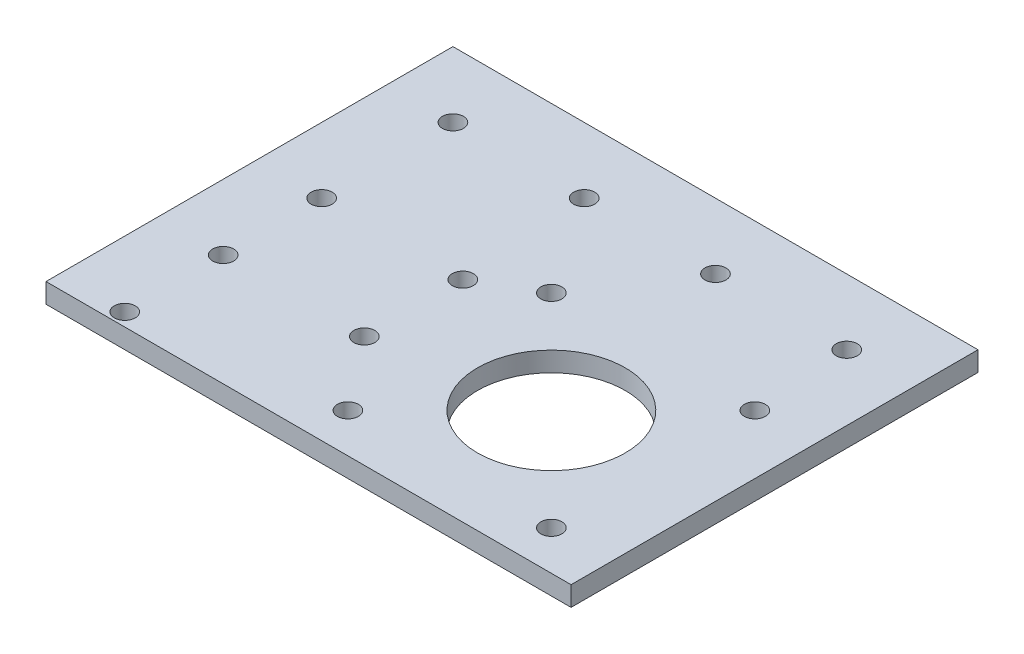
ISO-10303-21;
HEADER;
FILE_DESCRIPTION(('STEP AP214'),'2;1');
FILE_NAME('part.step','',(''),(''),'','','');
FILE_SCHEMA(('AUTOMOTIVE_DESIGN { 1 0 10303 214 1 1 1 1 }'));
ENDSEC;
DATA;
#1=APPLICATION_CONTEXT('core data for automotive mechanical design processes');
#2=APPLICATION_PROTOCOL_DEFINITION('international standard','automotive_design',2000,#1);
#3=PRODUCT_CONTEXT('',#1,'mechanical');
#4=PRODUCT('Part','Part','',(#3));
#5=PRODUCT_RELATED_PRODUCT_CATEGORY('part','',(#4));
#6=PRODUCT_DEFINITION_FORMATION('','',#4);
#7=PRODUCT_DEFINITION_CONTEXT('part definition',#1,'design');
#8=PRODUCT_DEFINITION('design','',#6,#7);
#9=PRODUCT_DEFINITION_SHAPE('','',#8);
#10=(LENGTH_UNIT() NAMED_UNIT(*) SI_UNIT(.MILLI.,.METRE.));
#11=(NAMED_UNIT(*) PLANE_ANGLE_UNIT() SI_UNIT($,.RADIAN.));
#12=(NAMED_UNIT(*) SI_UNIT($,.STERADIAN.) SOLID_ANGLE_UNIT());
#13=UNCERTAINTY_MEASURE_WITH_UNIT(LENGTH_MEASURE(1.E-05),#10,'distance_accuracy_value','');
#14=(GEOMETRIC_REPRESENTATION_CONTEXT(3) GLOBAL_UNCERTAINTY_ASSIGNED_CONTEXT((#13)) GLOBAL_UNIT_ASSIGNED_CONTEXT((#10,
#11,#12)) REPRESENTATION_CONTEXT('',''));
#15=CARTESIAN_POINT('',(0.,0.,0.));
#16=DIRECTION('',(0.,0.,1.));
#17=DIRECTION('',(1.,0.,0.));
#18=AXIS2_PLACEMENT_3D('',#15,#16,#17);
#19=CARTESIAN_POINT('',(0.,3.,0.));
#20=DIRECTION('',(0.,1.,0.));
#21=DIRECTION('',(0.,0.,1.));
#22=AXIS2_PLACEMENT_3D('',#19,#20,#21);
#23=PLANE('',#22);
#24=CARTESIAN_POINT('',(31.5,3.,45.));
#25=DIRECTION('',(0.,1.,0.));
#26=DIRECTION('',(0.,0.,1.));
#27=AXIS2_PLACEMENT_3D('',#24,#25,#26);
#28=CIRCLE('',#27,1.60000000000001);
#29=CARTESIAN_POINT('',(31.5,3.,46.6));
#30=VERTEX_POINT('',#29);
#31=EDGE_CURVE('E187',#30,#30,#28,.T.);
#32=ORIENTED_EDGE('',*,*,#31,.F.);
#33=EDGE_LOOP('',(#32));
#34=FACE_BOUND('',#33,.T.);
#35=CARTESIAN_POINT('',(71.,3.,56.));
#36=DIRECTION('',(0.,1.,0.));
#37=DIRECTION('',(0.,0.,1.));
#38=AXIS2_PLACEMENT_3D('',#35,#36,#37);
#39=CIRCLE('',#38,1.60000000000002);
#40=CARTESIAN_POINT('',(71.,3.,57.6));
#41=VERTEX_POINT('',#40);
#42=EDGE_CURVE('E175',#41,#41,#39,.T.);
#43=ORIENTED_EDGE('',*,*,#42,.F.);
#44=EDGE_LOOP('',(#43));
#45=FACE_BOUND('',#44,.T.);
#46=CARTESIAN_POINT('',(70.,3.,10.));
#47=DIRECTION('',(0.,1.,0.));
#48=DIRECTION('',(0.,0.,1.));
#49=AXIS2_PLACEMENT_3D('',#46,#47,#48);
#50=CIRCLE('',#49,1.60000000000002);
#51=CARTESIAN_POINT('',(70.,3.,11.6));
#52=VERTEX_POINT('',#51);
#53=EDGE_CURVE('E163',#52,#52,#50,.T.);
#54=ORIENTED_EDGE('',*,*,#53,.F.);
#55=EDGE_LOOP('',(#54));
#56=FACE_BOUND('',#55,.T.);
#57=CARTESIAN_POINT('',(50.,3.,10.));
#58=DIRECTION('',(0.,1.,0.));
#59=DIRECTION('',(0.,0.,1.));
#60=AXIS2_PLACEMENT_3D('',#57,#58,#59);
#61=CIRCLE('',#60,1.60000000000001);
#62=CARTESIAN_POINT('',(50.,3.,11.6));
#63=VERTEX_POINT('',#62);
#64=EDGE_CURVE('E151',#63,#63,#61,.T.);
#65=ORIENTED_EDGE('',*,*,#64,.F.);
#66=EDGE_LOOP('',(#65));
#67=FACE_BOUND('',#66,.T.);
#68=CARTESIAN_POINT('',(10.,3.,60.));
#69=DIRECTION('',(0.,1.,0.));
#70=DIRECTION('',(0.,0.,1.));
#71=AXIS2_PLACEMENT_3D('',#68,#69,#70);
#72=CIRCLE('',#71,1.60000000000001);
#73=CARTESIAN_POINT('',(10.,3.,61.6));
#74=VERTEX_POINT('',#73);
#75=EDGE_CURVE('E139',#74,#74,#72,.T.);
#76=ORIENTED_EDGE('',*,*,#75,.F.);
#77=EDGE_LOOP('',(#76));
#78=FACE_BOUND('',#77,.T.);
#79=CARTESIAN_POINT('',(10.,3.,45.));
#80=DIRECTION('',(0.,1.,0.));
#81=DIRECTION('',(0.,0.,1.));
#82=AXIS2_PLACEMENT_3D('',#79,#80,#81);
#83=CIRCLE('',#82,1.6);
#84=CARTESIAN_POINT('',(10.,3.,46.6));
#85=VERTEX_POINT('',#84);
#86=EDGE_CURVE('E127',#85,#85,#83,.T.);
#87=ORIENTED_EDGE('',*,*,#86,.F.);
#88=EDGE_LOOP('',(#87));
#89=FACE_BOUND('',#88,.T.);
#90=CARTESIAN_POINT('',(10.,3.,10.));
#91=DIRECTION('',(0.,1.,0.));
#92=DIRECTION('',(0.,0.,1.));
#93=AXIS2_PLACEMENT_3D('',#90,#91,#92);
#94=CIRCLE('',#93,1.6);
#95=CARTESIAN_POINT('',(10.,3.,11.6));
#96=VERTEX_POINT('',#95);
#97=EDGE_CURVE('E106',#96,#96,#94,.T.);
#98=ORIENTED_EDGE('',*,*,#97,.F.);
#99=EDGE_LOOP('',(#98));
#100=FACE_BOUND('',#99,.T.);
#101=DIRECTION('',(0.,0.,1.));
#102=VECTOR('',#101,1.);
#103=CARTESIAN_POINT('',(0.,3.,0.));
#104=LINE('',#103,#102);
#105=CARTESIAN_POINT('',(0.,3.,0.));
#106=VERTEX_POINT('',#105);
#107=CARTESIAN_POINT('',(0.,3.,62.));
#108=VERTEX_POINT('',#107);
#109=EDGE_CURVE('E91',#106,#108,#104,.T.);
#110=ORIENTED_EDGE('',*,*,#109,.T.);
#111=DIRECTION('',(1.,0.,0.));
#112=VECTOR('',#111,1.);
#113=CARTESIAN_POINT('',(0.,3.,62.));
#114=LINE('',#113,#112);
#115=CARTESIAN_POINT('',(80.,3.,62.));
#116=VERTEX_POINT('',#115);
#117=EDGE_CURVE('E86',#108,#116,#114,.T.);
#118=ORIENTED_EDGE('',*,*,#117,.T.);
#119=DIRECTION('',(0.,0.,-1.));
#120=VECTOR('',#119,1.);
#121=CARTESIAN_POINT('',(80.,3.,0.));
#122=LINE('',#121,#120);
#123=CARTESIAN_POINT('',(80.,3.,0.));
#124=VERTEX_POINT('',#123);
#125=EDGE_CURVE('E89',#116,#124,#122,.T.);
#126=ORIENTED_EDGE('',*,*,#125,.T.);
#127=DIRECTION('',(-1.,0.,0.));
#128=VECTOR('',#127,1.);
#129=CARTESIAN_POINT('',(0.,3.,0.));
#130=LINE('',#129,#128);
#131=EDGE_CURVE('E56',#124,#106,#130,.T.);
#132=ORIENTED_EDGE('',*,*,#131,.T.);
#133=EDGE_LOOP('',(#110,#118,#126,#132));
#134=FACE_BOUND('',#133,.T.);
#135=CARTESIAN_POINT('',(10.,3.,30.));
#136=DIRECTION('',(0.,1.,0.));
#137=DIRECTION('',(0.,0.,1.));
#138=AXIS2_PLACEMENT_3D('',#135,#136,#137);
#139=CIRCLE('',#138,1.6);
#140=CARTESIAN_POINT('',(10.,3.,31.6));
#141=VERTEX_POINT('',#140);
#142=EDGE_CURVE('E121',#141,#141,#139,.T.);
#143=ORIENTED_EDGE('',*,*,#142,.F.);
#144=EDGE_LOOP('',(#143));
#145=FACE_BOUND('',#144,.T.);
#146=CARTESIAN_POINT('',(30.,3.,10.));
#147=DIRECTION('',(0.,1.,0.));
#148=DIRECTION('',(0.,0.,1.));
#149=AXIS2_PLACEMENT_3D('',#146,#147,#148);
#150=CIRCLE('',#149,1.60000000000001);
#151=CARTESIAN_POINT('',(30.,3.,11.6));
#152=VERTEX_POINT('',#151);
#153=EDGE_CURVE('E133',#152,#152,#150,.T.);
#154=ORIENTED_EDGE('',*,*,#153,.F.);
#155=EDGE_LOOP('',(#154));
#156=FACE_BOUND('',#155,.T.);
#157=CARTESIAN_POINT('',(71.,3.,25.));
#158=DIRECTION('',(0.,1.,0.));
#159=DIRECTION('',(0.,0.,1.));
#160=AXIS2_PLACEMENT_3D('',#157,#158,#159);
#161=CIRCLE('',#160,1.60000000000002);
#162=CARTESIAN_POINT('',(71.,3.,26.6));
#163=VERTEX_POINT('',#162);
#164=EDGE_CURVE('E145',#163,#163,#161,.T.);
#165=ORIENTED_EDGE('',*,*,#164,.F.);
#166=EDGE_LOOP('',(#165));
#167=FACE_BOUND('',#166,.T.);
#168=CARTESIAN_POINT('',(40.,3.,25.));
#169=DIRECTION('',(0.,1.,0.));
#170=DIRECTION('',(0.,0.,1.));
#171=AXIS2_PLACEMENT_3D('',#168,#169,#170);
#172=CIRCLE('',#171,1.60000000000001);
#173=CARTESIAN_POINT('',(40.,3.,26.6));
#174=VERTEX_POINT('',#173);
#175=EDGE_CURVE('E157',#174,#174,#172,.T.);
#176=ORIENTED_EDGE('',*,*,#175,.F.);
#177=EDGE_LOOP('',(#176));
#178=FACE_BOUND('',#177,.T.);
#179=CARTESIAN_POINT('',(40.,3.,56.));
#180=DIRECTION('',(0.,1.,0.));
#181=DIRECTION('',(0.,0.,1.));
#182=AXIS2_PLACEMENT_3D('',#179,#180,#181);
#183=CIRCLE('',#182,1.60000000000001);
#184=CARTESIAN_POINT('',(40.,3.,57.6));
#185=VERTEX_POINT('',#184);
#186=EDGE_CURVE('E169',#185,#185,#183,.T.);
#187=ORIENTED_EDGE('',*,*,#186,.F.);
#188=EDGE_LOOP('',(#187));
#189=FACE_BOUND('',#188,.T.);
#190=CARTESIAN_POINT('',(31.5,3.,30.));
#191=DIRECTION('',(0.,1.,0.));
#192=DIRECTION('',(0.,0.,1.));
#193=AXIS2_PLACEMENT_3D('',#190,#191,#192);
#194=CIRCLE('',#193,1.6);
#195=CARTESIAN_POINT('',(31.5,3.,31.6));
#196=VERTEX_POINT('',#195);
#197=EDGE_CURVE('E181',#196,#196,#194,.T.);
#198=ORIENTED_EDGE('',*,*,#197,.F.);
#199=EDGE_LOOP('',(#198));
#200=FACE_BOUND('',#199,.T.);
#201=CARTESIAN_POINT('',(55.5,3.,40.5));
#202=DIRECTION('',(0.,1.,0.));
#203=DIRECTION('',(0.,0.,1.));
#204=AXIS2_PLACEMENT_3D('',#201,#202,#203);
#205=CIRCLE('',#204,11.25);
#206=CARTESIAN_POINT('',(55.5,3.,51.75));
#207=VERTEX_POINT('',#206);
#208=EDGE_CURVE('E193',#207,#207,#205,.T.);
#209=ORIENTED_EDGE('',*,*,#208,.F.);
#210=EDGE_LOOP('',(#209));
#211=FACE_BOUND('',#210,.T.);
#212=ADVANCED_FACE('F39',(#34,#45,#56,#67,#78,#89,#100,#134,#145,#156,#167,#178,#189,#200,#211),
#23,.T.);
#213=CARTESIAN_POINT('',(0.,0.,0.));
#214=DIRECTION('',(0.,1.,0.));
#215=DIRECTION('',(0.,0.,1.));
#216=AXIS2_PLACEMENT_3D('',#213,#214,#215);
#217=PLANE('',#216);
#218=DIRECTION('',(0.,0.,1.));
#219=VECTOR('',#218,1.);
#220=CARTESIAN_POINT('',(0.,0.,0.));
#221=LINE('',#220,#219);
#222=CARTESIAN_POINT('',(0.,0.,0.));
#223=VERTEX_POINT('',#222);
#224=CARTESIAN_POINT('',(0.,0.,62.));
#225=VERTEX_POINT('',#224);
#226=EDGE_CURVE('E103',#223,#225,#221,.T.);
#227=ORIENTED_EDGE('',*,*,#226,.F.);
#228=DIRECTION('',(-1.,0.,0.));
#229=VECTOR('',#228,1.);
#230=CARTESIAN_POINT('',(0.,0.,0.));
#231=LINE('',#230,#229);
#232=CARTESIAN_POINT('',(80.,0.,0.));
#233=VERTEX_POINT('',#232);
#234=EDGE_CURVE('E79',#233,#223,#231,.T.);
#235=ORIENTED_EDGE('',*,*,#234,.F.);
#236=DIRECTION('',(0.,0.,-1.));
#237=VECTOR('',#236,1.);
#238=CARTESIAN_POINT('',(80.,0.,0.));
#239=LINE('',#238,#237);
#240=CARTESIAN_POINT('',(80.,0.,62.));
#241=VERTEX_POINT('',#240);
#242=EDGE_CURVE('E73',#241,#233,#239,.T.);
#243=ORIENTED_EDGE('',*,*,#242,.F.);
#244=DIRECTION('',(1.,0.,0.));
#245=VECTOR('',#244,1.);
#246=CARTESIAN_POINT('',(0.,0.,62.));
#247=LINE('',#246,#245);
#248=EDGE_CURVE('E95',#225,#241,#247,.T.);
#249=ORIENTED_EDGE('',*,*,#248,.F.);
#250=EDGE_LOOP('',(#227,#235,#243,#249));
#251=FACE_BOUND('',#250,.T.);
#252=CARTESIAN_POINT('',(10.,0.,10.));
#253=DIRECTION('',(0.,1.,0.));
#254=DIRECTION('',(0.,0.,1.));
#255=AXIS2_PLACEMENT_3D('',#252,#253,#254);
#256=CIRCLE('',#255,1.6);
#257=CARTESIAN_POINT('',(10.,0.,11.6));
#258=VERTEX_POINT('',#257);
#259=EDGE_CURVE('E118',#258,#258,#256,.T.);
#260=ORIENTED_EDGE('',*,*,#259,.T.);
#261=EDGE_LOOP('',(#260));
#262=FACE_BOUND('',#261,.T.);
#263=CARTESIAN_POINT('',(10.,0.,30.));
#264=DIRECTION('',(0.,1.,0.));
#265=DIRECTION('',(0.,0.,1.));
#266=AXIS2_PLACEMENT_3D('',#263,#264,#265);
#267=CIRCLE('',#266,1.6);
#268=CARTESIAN_POINT('',(10.,0.,31.6));
#269=VERTEX_POINT('',#268);
#270=EDGE_CURVE('E124',#269,#269,#267,.T.);
#271=ORIENTED_EDGE('',*,*,#270,.T.);
#272=EDGE_LOOP('',(#271));
#273=FACE_BOUND('',#272,.T.);
#274=CARTESIAN_POINT('',(10.,0.,45.));
#275=DIRECTION('',(0.,1.,0.));
#276=DIRECTION('',(0.,0.,1.));
#277=AXIS2_PLACEMENT_3D('',#274,#275,#276);
#278=CIRCLE('',#277,1.6);
#279=CARTESIAN_POINT('',(10.,0.,46.6));
#280=VERTEX_POINT('',#279);
#281=EDGE_CURVE('E130',#280,#280,#278,.T.);
#282=ORIENTED_EDGE('',*,*,#281,.T.);
#283=EDGE_LOOP('',(#282));
#284=FACE_BOUND('',#283,.T.);
#285=CARTESIAN_POINT('',(30.,0.,10.));
#286=DIRECTION('',(0.,1.,0.));
#287=DIRECTION('',(0.,0.,1.));
#288=AXIS2_PLACEMENT_3D('',#285,#286,#287);
#289=CIRCLE('',#288,1.60000000000001);
#290=CARTESIAN_POINT('',(30.,0.,11.6));
#291=VERTEX_POINT('',#290);
#292=EDGE_CURVE('E136',#291,#291,#289,.T.);
#293=ORIENTED_EDGE('',*,*,#292,.T.);
#294=EDGE_LOOP('',(#293));
#295=FACE_BOUND('',#294,.T.);
#296=CARTESIAN_POINT('',(10.,0.,60.));
#297=DIRECTION('',(0.,1.,0.));
#298=DIRECTION('',(0.,0.,1.));
#299=AXIS2_PLACEMENT_3D('',#296,#297,#298);
#300=CIRCLE('',#299,1.60000000000001);
#301=CARTESIAN_POINT('',(10.,0.,61.6));
#302=VERTEX_POINT('',#301);
#303=EDGE_CURVE('E142',#302,#302,#300,.T.);
#304=ORIENTED_EDGE('',*,*,#303,.T.);
#305=EDGE_LOOP('',(#304));
#306=FACE_BOUND('',#305,.T.);
#307=CARTESIAN_POINT('',(71.,0.,25.));
#308=DIRECTION('',(0.,1.,0.));
#309=DIRECTION('',(0.,0.,1.));
#310=AXIS2_PLACEMENT_3D('',#307,#308,#309);
#311=CIRCLE('',#310,1.60000000000002);
#312=CARTESIAN_POINT('',(71.,0.,26.6));
#313=VERTEX_POINT('',#312);
#314=EDGE_CURVE('E148',#313,#313,#311,.T.);
#315=ORIENTED_EDGE('',*,*,#314,.T.);
#316=EDGE_LOOP('',(#315));
#317=FACE_BOUND('',#316,.T.);
#318=CARTESIAN_POINT('',(50.,0.,10.));
#319=DIRECTION('',(0.,1.,0.));
#320=DIRECTION('',(0.,0.,1.));
#321=AXIS2_PLACEMENT_3D('',#318,#319,#320);
#322=CIRCLE('',#321,1.60000000000001);
#323=CARTESIAN_POINT('',(50.,0.,11.6));
#324=VERTEX_POINT('',#323);
#325=EDGE_CURVE('E154',#324,#324,#322,.T.);
#326=ORIENTED_EDGE('',*,*,#325,.T.);
#327=EDGE_LOOP('',(#326));
#328=FACE_BOUND('',#327,.T.);
#329=CARTESIAN_POINT('',(40.,0.,25.));
#330=DIRECTION('',(0.,1.,0.));
#331=DIRECTION('',(0.,0.,1.));
#332=AXIS2_PLACEMENT_3D('',#329,#330,#331);
#333=CIRCLE('',#332,1.60000000000001);
#334=CARTESIAN_POINT('',(40.,0.,26.6));
#335=VERTEX_POINT('',#334);
#336=EDGE_CURVE('E160',#335,#335,#333,.T.);
#337=ORIENTED_EDGE('',*,*,#336,.T.);
#338=EDGE_LOOP('',(#337));
#339=FACE_BOUND('',#338,.T.);
#340=CARTESIAN_POINT('',(70.,0.,10.));
#341=DIRECTION('',(0.,1.,0.));
#342=DIRECTION('',(0.,0.,1.));
#343=AXIS2_PLACEMENT_3D('',#340,#341,#342);
#344=CIRCLE('',#343,1.60000000000002);
#345=CARTESIAN_POINT('',(70.,0.,11.6));
#346=VERTEX_POINT('',#345);
#347=EDGE_CURVE('E166',#346,#346,#344,.T.);
#348=ORIENTED_EDGE('',*,*,#347,.T.);
#349=EDGE_LOOP('',(#348));
#350=FACE_BOUND('',#349,.T.);
#351=CARTESIAN_POINT('',(40.,0.,56.));
#352=DIRECTION('',(0.,1.,0.));
#353=DIRECTION('',(0.,0.,1.));
#354=AXIS2_PLACEMENT_3D('',#351,#352,#353);
#355=CIRCLE('',#354,1.60000000000001);
#356=CARTESIAN_POINT('',(40.,0.,57.6));
#357=VERTEX_POINT('',#356);
#358=EDGE_CURVE('E172',#357,#357,#355,.T.);
#359=ORIENTED_EDGE('',*,*,#358,.T.);
#360=EDGE_LOOP('',(#359));
#361=FACE_BOUND('',#360,.T.);
#362=CARTESIAN_POINT('',(71.,0.,56.));
#363=DIRECTION('',(0.,1.,0.));
#364=DIRECTION('',(0.,0.,1.));
#365=AXIS2_PLACEMENT_3D('',#362,#363,#364);
#366=CIRCLE('',#365,1.60000000000002);
#367=CARTESIAN_POINT('',(71.,0.,57.6));
#368=VERTEX_POINT('',#367);
#369=EDGE_CURVE('E178',#368,#368,#366,.T.);
#370=ORIENTED_EDGE('',*,*,#369,.T.);
#371=EDGE_LOOP('',(#370));
#372=FACE_BOUND('',#371,.T.);
#373=CARTESIAN_POINT('',(31.5,0.,30.));
#374=DIRECTION('',(0.,1.,0.));
#375=DIRECTION('',(0.,0.,1.));
#376=AXIS2_PLACEMENT_3D('',#373,#374,#375);
#377=CIRCLE('',#376,1.6);
#378=CARTESIAN_POINT('',(31.5,0.,31.6));
#379=VERTEX_POINT('',#378);
#380=EDGE_CURVE('E184',#379,#379,#377,.T.);
#381=ORIENTED_EDGE('',*,*,#380,.T.);
#382=EDGE_LOOP('',(#381));
#383=FACE_BOUND('',#382,.T.);
#384=CARTESIAN_POINT('',(31.5,0.,45.));
#385=DIRECTION('',(0.,1.,0.));
#386=DIRECTION('',(0.,0.,1.));
#387=AXIS2_PLACEMENT_3D('',#384,#385,#386);
#388=CIRCLE('',#387,1.60000000000001);
#389=CARTESIAN_POINT('',(31.5,0.,46.6));
#390=VERTEX_POINT('',#389);
#391=EDGE_CURVE('E190',#390,#390,#388,.T.);
#392=ORIENTED_EDGE('',*,*,#391,.T.);
#393=EDGE_LOOP('',(#392));
#394=FACE_BOUND('',#393,.T.);
#395=CARTESIAN_POINT('',(55.5,0.,40.5));
#396=DIRECTION('',(0.,1.,0.));
#397=DIRECTION('',(0.,0.,1.));
#398=AXIS2_PLACEMENT_3D('',#395,#396,#397);
#399=CIRCLE('',#398,11.25);
#400=CARTESIAN_POINT('',(55.5,0.,51.75));
#401=VERTEX_POINT('',#400);
#402=EDGE_CURVE('E196',#401,#401,#399,.T.);
#403=ORIENTED_EDGE('',*,*,#402,.T.);
#404=EDGE_LOOP('',(#403));
#405=FACE_BOUND('',#404,.T.);
#406=ADVANCED_FACE('F114',(#251,#262,#273,#284,#295,#306,#317,#328,#339,#350,#361,#372,#383,
#394,#405),#217,.F.);
#407=CARTESIAN_POINT('',(0.,3.,0.));
#408=DIRECTION('',(1.,0.,0.));
#409=DIRECTION('',(0.,0.,-1.));
#410=AXIS2_PLACEMENT_3D('',#407,#408,#409);
#411=PLANE('',#410);
#412=ORIENTED_EDGE('',*,*,#226,.T.);
#413=DIRECTION('',(0.,-1.,0.));
#414=VECTOR('',#413,1.);
#415=CARTESIAN_POINT('',(0.,3.,62.));
#416=LINE('',#415,#414);
#417=EDGE_CURVE('E11',#108,#225,#416,.T.);
#418=ORIENTED_EDGE('',*,*,#417,.F.);
#419=ORIENTED_EDGE('',*,*,#109,.F.);
#420=DIRECTION('',(0.,-1.,0.));
#421=VECTOR('',#420,1.);
#422=CARTESIAN_POINT('',(0.,3.,0.));
#423=LINE('',#422,#421);
#424=EDGE_CURVE('E99',#106,#223,#423,.T.);
#425=ORIENTED_EDGE('',*,*,#424,.T.);
#426=EDGE_LOOP('',(#412,#418,#419,#425));
#427=FACE_BOUND('',#426,.T.);
#428=ADVANCED_FACE('F41',(#427),#411,.F.);
#429=CARTESIAN_POINT('',(0.,3.,62.));
#430=DIRECTION('',(0.,0.,-1.));
#431=DIRECTION('',(-1.,0.,0.));
#432=AXIS2_PLACEMENT_3D('',#429,#430,#431);
#433=PLANE('',#432);
#434=ORIENTED_EDGE('',*,*,#248,.T.);
#435=DIRECTION('',(0.,-1.,0.));
#436=VECTOR('',#435,1.);
#437=CARTESIAN_POINT('',(80.,3.,62.));
#438=LINE('',#437,#436);
#439=EDGE_CURVE('E48',#116,#241,#438,.T.);
#440=ORIENTED_EDGE('',*,*,#439,.F.);
#441=ORIENTED_EDGE('',*,*,#117,.F.);
#442=ORIENTED_EDGE('',*,*,#417,.T.);
#443=EDGE_LOOP('',(#434,#440,#441,#442));
#444=FACE_BOUND('',#443,.T.);
#445=ADVANCED_FACE('F94',(#444),#433,.F.);
#446=CARTESIAN_POINT('',(80.,3.,0.));
#447=DIRECTION('',(-1.,0.,0.));
#448=DIRECTION('',(0.,0.,1.));
#449=AXIS2_PLACEMENT_3D('',#446,#447,#448);
#450=PLANE('',#449);
#451=ORIENTED_EDGE('',*,*,#242,.T.);
#452=DIRECTION('',(0.,-1.,0.));
#453=VECTOR('',#452,1.);
#454=CARTESIAN_POINT('',(80.,3.,0.));
#455=LINE('',#454,#453);
#456=EDGE_CURVE('E96',#124,#233,#455,.T.);
#457=ORIENTED_EDGE('',*,*,#456,.F.);
#458=ORIENTED_EDGE('',*,*,#125,.F.);
#459=ORIENTED_EDGE('',*,*,#439,.T.);
#460=EDGE_LOOP('',(#451,#457,#458,#459));
#461=FACE_BOUND('',#460,.T.);
#462=ADVANCED_FACE('F97',(#461),#450,.F.);
#463=CARTESIAN_POINT('',(0.,3.,0.));
#464=DIRECTION('',(0.,0.,1.));
#465=DIRECTION('',(1.,0.,0.));
#466=AXIS2_PLACEMENT_3D('',#463,#464,#465);
#467=PLANE('',#466);
#468=ORIENTED_EDGE('',*,*,#234,.T.);
#469=ORIENTED_EDGE('',*,*,#424,.F.);
#470=ORIENTED_EDGE('',*,*,#131,.F.);
#471=ORIENTED_EDGE('',*,*,#456,.T.);
#472=EDGE_LOOP('',(#468,#469,#470,#471));
#473=FACE_BOUND('',#472,.T.);
#474=ADVANCED_FACE('F111',(#473),#467,.F.);
#475=CARTESIAN_POINT('',(10.,3.,10.));
#476=DIRECTION('',(0.,-1.,0.));
#477=DIRECTION('',(0.,0.,-1.));
#478=AXIS2_PLACEMENT_3D('',#475,#476,#477);
#479=CYLINDRICAL_SURFACE('',#478,1.6);
#480=ORIENTED_EDGE('',*,*,#97,.T.);
#481=EDGE_LOOP('',(#480));
#482=FACE_BOUND('',#481,.T.);
#483=ORIENTED_EDGE('',*,*,#259,.F.);
#484=EDGE_LOOP('',(#483));
#485=FACE_BOUND('',#484,.T.);
#486=ADVANCED_FACE('F215',(#482,#485),#479,.F.);
#487=CARTESIAN_POINT('',(10.,3.,30.));
#488=DIRECTION('',(0.,-1.,0.));
#489=DIRECTION('',(0.,0.,-1.));
#490=AXIS2_PLACEMENT_3D('',#487,#488,#489);
#491=CYLINDRICAL_SURFACE('',#490,1.6);
#492=ORIENTED_EDGE('',*,*,#142,.T.);
#493=EDGE_LOOP('',(#492));
#494=FACE_BOUND('',#493,.T.);
#495=ORIENTED_EDGE('',*,*,#270,.F.);
#496=EDGE_LOOP('',(#495));
#497=FACE_BOUND('',#496,.T.);
#498=ADVANCED_FACE('F260',(#494,#497),#491,.F.);
#499=CARTESIAN_POINT('',(10.,3.,45.));
#500=DIRECTION('',(0.,-1.,0.));
#501=DIRECTION('',(0.,0.,-1.));
#502=AXIS2_PLACEMENT_3D('',#499,#500,#501);
#503=CYLINDRICAL_SURFACE('',#502,1.6);
#504=ORIENTED_EDGE('',*,*,#86,.T.);
#505=EDGE_LOOP('',(#504));
#506=FACE_BOUND('',#505,.T.);
#507=ORIENTED_EDGE('',*,*,#281,.F.);
#508=EDGE_LOOP('',(#507));
#509=FACE_BOUND('',#508,.T.);
#510=ADVANCED_FACE('F268',(#506,#509),#503,.F.);
#511=CARTESIAN_POINT('',(30.,3.,10.));
#512=DIRECTION('',(0.,-1.,0.));
#513=DIRECTION('',(0.,0.,-1.));
#514=AXIS2_PLACEMENT_3D('',#511,#512,#513);
#515=CYLINDRICAL_SURFACE('',#514,1.60000000000001);
#516=ORIENTED_EDGE('',*,*,#153,.T.);
#517=EDGE_LOOP('',(#516));
#518=FACE_BOUND('',#517,.T.);
#519=ORIENTED_EDGE('',*,*,#292,.F.);
#520=EDGE_LOOP('',(#519));
#521=FACE_BOUND('',#520,.T.);
#522=ADVANCED_FACE('F276',(#518,#521),#515,.F.);
#523=CARTESIAN_POINT('',(10.,3.,60.));
#524=DIRECTION('',(0.,-1.,0.));
#525=DIRECTION('',(0.,0.,-1.));
#526=AXIS2_PLACEMENT_3D('',#523,#524,#525);
#527=CYLINDRICAL_SURFACE('',#526,1.60000000000001);
#528=ORIENTED_EDGE('',*,*,#75,.T.);
#529=EDGE_LOOP('',(#528));
#530=FACE_BOUND('',#529,.T.);
#531=ORIENTED_EDGE('',*,*,#303,.F.);
#532=EDGE_LOOP('',(#531));
#533=FACE_BOUND('',#532,.T.);
#534=ADVANCED_FACE('F285',(#530,#533),#527,.F.);
#535=CARTESIAN_POINT('',(71.,3.,25.));
#536=DIRECTION('',(0.,-1.,0.));
#537=DIRECTION('',(0.,0.,-1.));
#538=AXIS2_PLACEMENT_3D('',#535,#536,#537);
#539=CYLINDRICAL_SURFACE('',#538,1.60000000000002);
#540=ORIENTED_EDGE('',*,*,#164,.T.);
#541=EDGE_LOOP('',(#540));
#542=FACE_BOUND('',#541,.T.);
#543=ORIENTED_EDGE('',*,*,#314,.F.);
#544=EDGE_LOOP('',(#543));
#545=FACE_BOUND('',#544,.T.);
#546=ADVANCED_FACE('F294',(#542,#545),#539,.F.);
#547=CARTESIAN_POINT('',(50.,3.,10.));
#548=DIRECTION('',(0.,-1.,0.));
#549=DIRECTION('',(0.,0.,-1.));
#550=AXIS2_PLACEMENT_3D('',#547,#548,#549);
#551=CYLINDRICAL_SURFACE('',#550,1.60000000000001);
#552=ORIENTED_EDGE('',*,*,#64,.T.);
#553=EDGE_LOOP('',(#552));
#554=FACE_BOUND('',#553,.T.);
#555=ORIENTED_EDGE('',*,*,#325,.F.);
#556=EDGE_LOOP('',(#555));
#557=FACE_BOUND('',#556,.T.);
#558=ADVANCED_FACE('F303',(#554,#557),#551,.F.);
#559=CARTESIAN_POINT('',(40.,3.,25.));
#560=DIRECTION('',(0.,-1.,0.));
#561=DIRECTION('',(0.,0.,-1.));
#562=AXIS2_PLACEMENT_3D('',#559,#560,#561);
#563=CYLINDRICAL_SURFACE('',#562,1.60000000000001);
#564=ORIENTED_EDGE('',*,*,#175,.T.);
#565=EDGE_LOOP('',(#564));
#566=FACE_BOUND('',#565,.T.);
#567=ORIENTED_EDGE('',*,*,#336,.F.);
#568=EDGE_LOOP('',(#567));
#569=FACE_BOUND('',#568,.T.);
#570=ADVANCED_FACE('F312',(#566,#569),#563,.F.);
#571=CARTESIAN_POINT('',(70.,3.,10.));
#572=DIRECTION('',(0.,-1.,0.));
#573=DIRECTION('',(0.,0.,-1.));
#574=AXIS2_PLACEMENT_3D('',#571,#572,#573);
#575=CYLINDRICAL_SURFACE('',#574,1.60000000000002);
#576=ORIENTED_EDGE('',*,*,#53,.T.);
#577=EDGE_LOOP('',(#576));
#578=FACE_BOUND('',#577,.T.);
#579=ORIENTED_EDGE('',*,*,#347,.F.);
#580=EDGE_LOOP('',(#579));
#581=FACE_BOUND('',#580,.T.);
#582=ADVANCED_FACE('F321',(#578,#581),#575,.F.);
#583=CARTESIAN_POINT('',(40.,3.,56.));
#584=DIRECTION('',(0.,-1.,0.));
#585=DIRECTION('',(0.,0.,-1.));
#586=AXIS2_PLACEMENT_3D('',#583,#584,#585);
#587=CYLINDRICAL_SURFACE('',#586,1.60000000000001);
#588=ORIENTED_EDGE('',*,*,#186,.T.);
#589=EDGE_LOOP('',(#588));
#590=FACE_BOUND('',#589,.T.);
#591=ORIENTED_EDGE('',*,*,#358,.F.);
#592=EDGE_LOOP('',(#591));
#593=FACE_BOUND('',#592,.T.);
#594=ADVANCED_FACE('F330',(#590,#593),#587,.F.);
#595=CARTESIAN_POINT('',(71.,3.,56.));
#596=DIRECTION('',(0.,-1.,0.));
#597=DIRECTION('',(0.,0.,-1.));
#598=AXIS2_PLACEMENT_3D('',#595,#596,#597);
#599=CYLINDRICAL_SURFACE('',#598,1.60000000000002);
#600=ORIENTED_EDGE('',*,*,#42,.T.);
#601=EDGE_LOOP('',(#600));
#602=FACE_BOUND('',#601,.T.);
#603=ORIENTED_EDGE('',*,*,#369,.F.);
#604=EDGE_LOOP('',(#603));
#605=FACE_BOUND('',#604,.T.);
#606=ADVANCED_FACE('F339',(#602,#605),#599,.F.);
#607=CARTESIAN_POINT('',(31.5,3.,30.));
#608=DIRECTION('',(0.,-1.,0.));
#609=DIRECTION('',(0.,0.,-1.));
#610=AXIS2_PLACEMENT_3D('',#607,#608,#609);
#611=CYLINDRICAL_SURFACE('',#610,1.6);
#612=ORIENTED_EDGE('',*,*,#197,.T.);
#613=EDGE_LOOP('',(#612));
#614=FACE_BOUND('',#613,.T.);
#615=ORIENTED_EDGE('',*,*,#380,.F.);
#616=EDGE_LOOP('',(#615));
#617=FACE_BOUND('',#616,.T.);
#618=ADVANCED_FACE('F348',(#614,#617),#611,.F.);
#619=CARTESIAN_POINT('',(31.5,3.,45.));
#620=DIRECTION('',(0.,-1.,0.));
#621=DIRECTION('',(0.,0.,-1.));
#622=AXIS2_PLACEMENT_3D('',#619,#620,#621);
#623=CYLINDRICAL_SURFACE('',#622,1.60000000000001);
#624=ORIENTED_EDGE('',*,*,#31,.T.);
#625=EDGE_LOOP('',(#624));
#626=FACE_BOUND('',#625,.T.);
#627=ORIENTED_EDGE('',*,*,#391,.F.);
#628=EDGE_LOOP('',(#627));
#629=FACE_BOUND('',#628,.T.);
#630=ADVANCED_FACE('F357',(#626,#629),#623,.F.);
#631=CARTESIAN_POINT('',(55.5,3.,40.5));
#632=DIRECTION('',(0.,-1.,0.));
#633=DIRECTION('',(0.,0.,-1.));
#634=AXIS2_PLACEMENT_3D('',#631,#632,#633);
#635=CYLINDRICAL_SURFACE('',#634,11.25);
#636=ORIENTED_EDGE('',*,*,#208,.T.);
#637=EDGE_LOOP('',(#636));
#638=FACE_BOUND('',#637,.T.);
#639=ORIENTED_EDGE('',*,*,#402,.F.);
#640=EDGE_LOOP('',(#639));
#641=FACE_BOUND('',#640,.T.);
#642=ADVANCED_FACE('F202',(#638,#641),#635,.F.);
#643=CLOSED_SHELL('',(#212,#406,#428,#445,#462,#474,#486,#498,#510,#522,#534,#546,#558,#570,
#582,#594,#606,#618,#630,#642));
#644=MANIFOLD_SOLID_BREP('B2',#643);
#645=ADVANCED_BREP_SHAPE_REPRESENTATION('',(#18,#644),#14);
#646=SHAPE_DEFINITION_REPRESENTATION(#9,#645);
ENDSEC;
END-ISO-10303-21;
